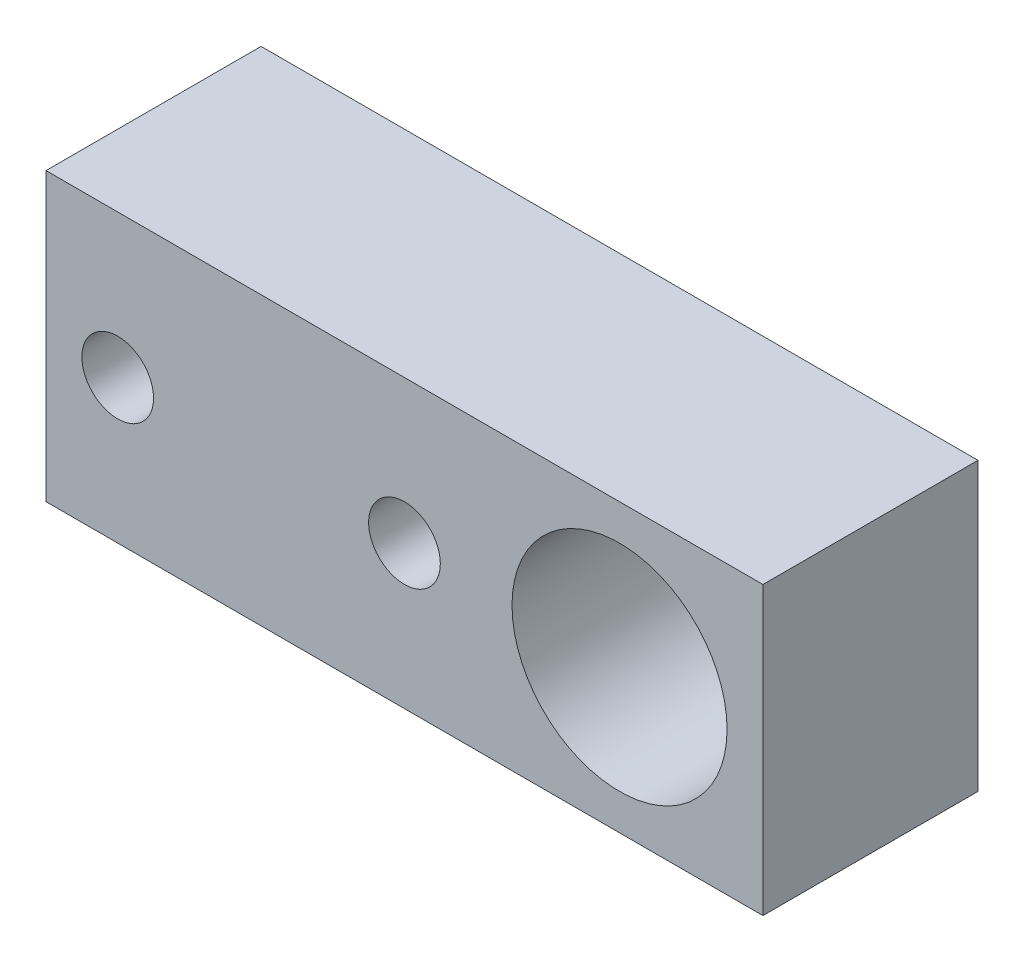
ISO-10303-21;
HEADER;
FILE_DESCRIPTION(('STEP AP214'),'2;1');
FILE_NAME('part.step','',(''),(''),'','','');
FILE_SCHEMA(('AUTOMOTIVE_DESIGN { 1 0 10303 214 1 1 1 1 }'));
ENDSEC;
DATA;
#1=APPLICATION_CONTEXT('core data for automotive mechanical design processes');
#2=APPLICATION_PROTOCOL_DEFINITION('international standard','automotive_design',2000,#1);
#3=PRODUCT_CONTEXT('',#1,'mechanical');
#4=PRODUCT('Part','Part','',(#3));
#5=PRODUCT_RELATED_PRODUCT_CATEGORY('part','',(#4));
#6=PRODUCT_DEFINITION_FORMATION('','',#4);
#7=PRODUCT_DEFINITION_CONTEXT('part definition',#1,'design');
#8=PRODUCT_DEFINITION('design','',#6,#7);
#9=PRODUCT_DEFINITION_SHAPE('','',#8);
#10=(LENGTH_UNIT() NAMED_UNIT(*) SI_UNIT(.MILLI.,.METRE.));
#11=(NAMED_UNIT(*) PLANE_ANGLE_UNIT() SI_UNIT($,.RADIAN.));
#12=(NAMED_UNIT(*) SI_UNIT($,.STERADIAN.) SOLID_ANGLE_UNIT());
#13=UNCERTAINTY_MEASURE_WITH_UNIT(LENGTH_MEASURE(1.E-05),#10,'distance_accuracy_value','');
#14=(GEOMETRIC_REPRESENTATION_CONTEXT(3) GLOBAL_UNCERTAINTY_ASSIGNED_CONTEXT((#13)) GLOBAL_UNIT_ASSIGNED_CONTEXT((#10,
#11,#12)) REPRESENTATION_CONTEXT('',''));
#15=CARTESIAN_POINT('',(0.,0.,0.));
#16=DIRECTION('',(0.,0.,1.));
#17=DIRECTION('',(1.,0.,0.));
#18=AXIS2_PLACEMENT_3D('',#15,#16,#17);
#19=CARTESIAN_POINT('',(25.,-10.,-7.5));
#20=DIRECTION('',(0.,0.,1.));
#21=DIRECTION('',(1.,0.,0.));
#22=AXIS2_PLACEMENT_3D('',#19,#20,#21);
#23=PLANE('',#22);
#24=CARTESIAN_POINT('',(0.,0.,-7.5));
#25=DIRECTION('',(0.,0.,1.));
#26=DIRECTION('',(1.,0.,0.));
#27=AXIS2_PLACEMENT_3D('',#24,#25,#26);
#28=CIRCLE('',#27,2.49999999999999);
#29=CARTESIAN_POINT('',(2.49999999999999,0.,-7.5));
#30=VERTEX_POINT('',#29);
#31=EDGE_CURVE('E123',#30,#30,#28,.T.);
#32=ORIENTED_EDGE('',*,*,#31,.T.);
#33=EDGE_LOOP('',(#32));
#34=FACE_BOUND('',#33,.T.);
#35=CARTESIAN_POINT('',(-20.,0.,-7.5));
#36=DIRECTION('',(0.,0.,1.));
#37=DIRECTION('',(1.,0.,0.));
#38=AXIS2_PLACEMENT_3D('',#35,#36,#37);
#39=CIRCLE('',#38,2.49999999999998);
#40=CARTESIAN_POINT('',(-17.5,0.,-7.5));
#41=VERTEX_POINT('',#40);
#42=EDGE_CURVE('E117',#41,#41,#39,.T.);
#43=ORIENTED_EDGE('',*,*,#42,.T.);
#44=EDGE_LOOP('',(#43));
#45=FACE_BOUND('',#44,.T.);
#46=CARTESIAN_POINT('',(15.,0.,-7.5));
#47=DIRECTION('',(0.,0.,1.));
#48=DIRECTION('',(1.,0.,0.));
#49=AXIS2_PLACEMENT_3D('',#46,#47,#48);
#50=CIRCLE('',#49,7.5);
#51=CARTESIAN_POINT('',(22.5,0.,-7.5));
#52=VERTEX_POINT('',#51);
#53=EDGE_CURVE('E114',#52,#52,#50,.T.);
#54=ORIENTED_EDGE('',*,*,#53,.T.);
#55=EDGE_LOOP('',(#54));
#56=FACE_BOUND('',#55,.T.);
#57=DIRECTION('',(0.,1.,0.));
#58=VECTOR('',#57,1.);
#59=CARTESIAN_POINT('',(-25.,-10.,-7.5));
#60=LINE('',#59,#58);
#61=CARTESIAN_POINT('',(-25.,-10.,-7.5));
#62=VERTEX_POINT('',#61);
#63=CARTESIAN_POINT('',(-25.,10.,-7.5));
#64=VERTEX_POINT('',#63);
#65=EDGE_CURVE('E101',#62,#64,#60,.T.);
#66=ORIENTED_EDGE('',*,*,#65,.T.);
#67=DIRECTION('',(-1.,0.,0.));
#68=VECTOR('',#67,1.);
#69=CARTESIAN_POINT('',(25.,10.,-7.5));
#70=LINE('',#69,#68);
#71=CARTESIAN_POINT('',(25.,10.,-7.5));
#72=VERTEX_POINT('',#71);
#73=EDGE_CURVE('E11',#72,#64,#70,.T.);
#74=ORIENTED_EDGE('',*,*,#73,.F.);
#75=DIRECTION('',(0.,1.,0.));
#76=VECTOR('',#75,1.);
#77=CARTESIAN_POINT('',(25.,-10.,-7.5));
#78=LINE('',#77,#76);
#79=CARTESIAN_POINT('',(25.,-10.,-7.5));
#80=VERTEX_POINT('',#79);
#81=EDGE_CURVE('E88',#80,#72,#78,.T.);
#82=ORIENTED_EDGE('',*,*,#81,.F.);
#83=DIRECTION('',(-1.,0.,0.));
#84=VECTOR('',#83,1.);
#85=CARTESIAN_POINT('',(25.,-10.,-7.5));
#86=LINE('',#85,#84);
#87=EDGE_CURVE('E97',#80,#62,#86,.T.);
#88=ORIENTED_EDGE('',*,*,#87,.T.);
#89=EDGE_LOOP('',(#66,#74,#82,#88));
#90=FACE_BOUND('',#89,.T.);
#91=ADVANCED_FACE('F36',(#34,#45,#56,#90),#23,.F.);
#92=CARTESIAN_POINT('',(25.,10.,7.5));
#93=DIRECTION('',(0.,-1.,0.));
#94=DIRECTION('',(0.,0.,-1.));
#95=AXIS2_PLACEMENT_3D('',#92,#93,#94);
#96=PLANE('',#95);
#97=DIRECTION('',(0.,0.,1.));
#98=VECTOR('',#97,1.);
#99=CARTESIAN_POINT('',(-25.,10.,7.5));
#100=LINE('',#99,#98);
#101=CARTESIAN_POINT('',(-25.,10.,7.5));
#102=VERTEX_POINT('',#101);
#103=EDGE_CURVE('E92',#64,#102,#100,.T.);
#104=ORIENTED_EDGE('',*,*,#103,.T.);
#105=DIRECTION('',(-1.,0.,0.));
#106=VECTOR('',#105,1.);
#107=CARTESIAN_POINT('',(25.,10.,7.5));
#108=LINE('',#107,#106);
#109=CARTESIAN_POINT('',(25.,10.,7.5));
#110=VERTEX_POINT('',#109);
#111=EDGE_CURVE('E45',#110,#102,#108,.T.);
#112=ORIENTED_EDGE('',*,*,#111,.F.);
#113=DIRECTION('',(0.,0.,1.));
#114=VECTOR('',#113,1.);
#115=CARTESIAN_POINT('',(25.,10.,7.5));
#116=LINE('',#115,#114);
#117=EDGE_CURVE('E83',#72,#110,#116,.T.);
#118=ORIENTED_EDGE('',*,*,#117,.F.);
#119=ORIENTED_EDGE('',*,*,#73,.T.);
#120=EDGE_LOOP('',(#104,#112,#118,#119));
#121=FACE_BOUND('',#120,.T.);
#122=ADVANCED_FACE('F91',(#121),#96,.F.);
#123=CARTESIAN_POINT('',(25.,-10.,7.5));
#124=DIRECTION('',(0.,0.,-1.));
#125=DIRECTION('',(-1.,0.,0.));
#126=AXIS2_PLACEMENT_3D('',#123,#124,#125);
#127=PLANE('',#126);
#128=CARTESIAN_POINT('',(0.,0.,7.5));
#129=DIRECTION('',(0.,0.,1.));
#130=DIRECTION('',(1.,0.,0.));
#131=AXIS2_PLACEMENT_3D('',#128,#129,#130);
#132=CIRCLE('',#131,2.49999999999999);
#133=CARTESIAN_POINT('',(2.49999999999999,0.,7.5));
#134=VERTEX_POINT('',#133);
#135=EDGE_CURVE('E126',#134,#134,#132,.T.);
#136=ORIENTED_EDGE('',*,*,#135,.F.);
#137=EDGE_LOOP('',(#136));
#138=FACE_BOUND('',#137,.T.);
#139=CARTESIAN_POINT('',(-20.,0.,7.5));
#140=DIRECTION('',(0.,0.,1.));
#141=DIRECTION('',(1.,0.,0.));
#142=AXIS2_PLACEMENT_3D('',#139,#140,#141);
#143=CIRCLE('',#142,2.49999999999999);
#144=CARTESIAN_POINT('',(-17.5,0.,7.5));
#145=VERTEX_POINT('',#144);
#146=EDGE_CURVE('E120',#145,#145,#143,.T.);
#147=ORIENTED_EDGE('',*,*,#146,.F.);
#148=EDGE_LOOP('',(#147));
#149=FACE_BOUND('',#148,.T.);
#150=CARTESIAN_POINT('',(15.,0.,7.5));
#151=DIRECTION('',(0.,0.,-1.));
#152=DIRECTION('',(-1.,0.,0.));
#153=AXIS2_PLACEMENT_3D('',#150,#151,#152);
#154=CIRCLE('',#153,7.5);
#155=CARTESIAN_POINT('',(7.5,0.,7.5));
#156=VERTEX_POINT('',#155);
#157=EDGE_CURVE('E39',#156,#156,#154,.T.);
#158=ORIENTED_EDGE('',*,*,#157,.T.);
#159=EDGE_LOOP('',(#158));
#160=FACE_BOUND('',#159,.T.);
#161=DIRECTION('',(0.,-1.,0.));
#162=VECTOR('',#161,1.);
#163=CARTESIAN_POINT('',(-25.,-10.,7.5));
#164=LINE('',#163,#162);
#165=CARTESIAN_POINT('',(-25.,-10.,7.5));
#166=VERTEX_POINT('',#165);
#167=EDGE_CURVE('E70',#102,#166,#164,.T.);
#168=ORIENTED_EDGE('',*,*,#167,.T.);
#169=DIRECTION('',(-1.,0.,0.));
#170=VECTOR('',#169,1.);
#171=CARTESIAN_POINT('',(25.,-10.,7.5));
#172=LINE('',#171,#170);
#173=CARTESIAN_POINT('',(25.,-10.,7.5));
#174=VERTEX_POINT('',#173);
#175=EDGE_CURVE('E93',#174,#166,#172,.T.);
#176=ORIENTED_EDGE('',*,*,#175,.F.);
#177=DIRECTION('',(0.,-1.,0.));
#178=VECTOR('',#177,1.);
#179=CARTESIAN_POINT('',(25.,-10.,7.5));
#180=LINE('',#179,#178);
#181=EDGE_CURVE('E86',#110,#174,#180,.T.);
#182=ORIENTED_EDGE('',*,*,#181,.F.);
#183=ORIENTED_EDGE('',*,*,#111,.T.);
#184=EDGE_LOOP('',(#168,#176,#182,#183));
#185=FACE_BOUND('',#184,.T.);
#186=ADVANCED_FACE('F95',(#138,#149,#160,#185),#127,.F.);
#187=CARTESIAN_POINT('',(25.,-10.,7.5));
#188=DIRECTION('',(0.,1.,0.));
#189=DIRECTION('',(0.,0.,1.));
#190=AXIS2_PLACEMENT_3D('',#187,#188,#189);
#191=PLANE('',#190);
#192=DIRECTION('',(0.,0.,-1.));
#193=VECTOR('',#192,1.);
#194=CARTESIAN_POINT('',(-25.,-10.,7.5));
#195=LINE('',#194,#193);
#196=EDGE_CURVE('E76',#166,#62,#195,.T.);
#197=ORIENTED_EDGE('',*,*,#196,.T.);
#198=ORIENTED_EDGE('',*,*,#87,.F.);
#199=DIRECTION('',(0.,0.,-1.));
#200=VECTOR('',#199,1.);
#201=CARTESIAN_POINT('',(25.,-10.,7.5));
#202=LINE('',#201,#200);
#203=EDGE_CURVE('E53',#174,#80,#202,.T.);
#204=ORIENTED_EDGE('',*,*,#203,.F.);
#205=ORIENTED_EDGE('',*,*,#175,.T.);
#206=EDGE_LOOP('',(#197,#198,#204,#205));
#207=FACE_BOUND('',#206,.T.);
#208=ADVANCED_FACE('F108',(#207),#191,.F.);
#209=CARTESIAN_POINT('',(25.,0.,0.));
#210=DIRECTION('',(-1.,0.,0.));
#211=DIRECTION('',(0.,0.,1.));
#212=AXIS2_PLACEMENT_3D('',#209,#210,#211);
#213=PLANE('',#212);
#214=ORIENTED_EDGE('',*,*,#81,.T.);
#215=ORIENTED_EDGE('',*,*,#117,.T.);
#216=ORIENTED_EDGE('',*,*,#181,.T.);
#217=ORIENTED_EDGE('',*,*,#203,.T.);
#218=EDGE_LOOP('',(#214,#215,#216,#217));
#219=FACE_BOUND('',#218,.T.);
#220=ADVANCED_FACE('F84',(#219),#213,.F.);
#221=CARTESIAN_POINT('',(-25.,0.,0.));
#222=DIRECTION('',(-1.,0.,0.));
#223=DIRECTION('',(0.,0.,1.));
#224=AXIS2_PLACEMENT_3D('',#221,#222,#223);
#225=PLANE('',#224);
#226=ORIENTED_EDGE('',*,*,#65,.F.);
#227=ORIENTED_EDGE('',*,*,#196,.F.);
#228=ORIENTED_EDGE('',*,*,#167,.F.);
#229=ORIENTED_EDGE('',*,*,#103,.F.);
#230=EDGE_LOOP('',(#226,#227,#228,#229));
#231=FACE_BOUND('',#230,.T.);
#232=ADVANCED_FACE('F111',(#231),#225,.T.);
#233=CARTESIAN_POINT('',(15.,0.,-7.5));
#234=DIRECTION('',(0.,0.,1.));
#235=DIRECTION('',(1.,0.,0.));
#236=AXIS2_PLACEMENT_3D('',#233,#234,#235);
#237=CYLINDRICAL_SURFACE('',#236,7.5);
#238=ORIENTED_EDGE('',*,*,#53,.F.);
#239=EDGE_LOOP('',(#238));
#240=FACE_BOUND('',#239,.T.);
#241=ORIENTED_EDGE('',*,*,#157,.F.);
#242=EDGE_LOOP('',(#241));
#243=FACE_BOUND('',#242,.T.);
#244=ADVANCED_FACE('F140',(#240,#243),#237,.F.);
#245=CARTESIAN_POINT('',(-20.,0.,7.5));
#246=DIRECTION('',(0.,0.,1.));
#247=DIRECTION('',(1.,0.,0.));
#248=AXIS2_PLACEMENT_3D('',#245,#246,#247);
#249=CYLINDRICAL_SURFACE('',#248,2.49999999999999);
#250=ORIENTED_EDGE('',*,*,#42,.F.);
#251=EDGE_LOOP('',(#250));
#252=FACE_BOUND('',#251,.T.);
#253=ORIENTED_EDGE('',*,*,#146,.T.);
#254=EDGE_LOOP('',(#253));
#255=FACE_BOUND('',#254,.T.);
#256=ADVANCED_FACE('F142',(#252,#255),#249,.F.);
#257=CARTESIAN_POINT('',(0.,0.,7.5));
#258=DIRECTION('',(0.,0.,1.));
#259=DIRECTION('',(1.,0.,0.));
#260=AXIS2_PLACEMENT_3D('',#257,#258,#259);
#261=CYLINDRICAL_SURFACE('',#260,2.49999999999999);
#262=ORIENTED_EDGE('',*,*,#31,.F.);
#263=EDGE_LOOP('',(#262));
#264=FACE_BOUND('',#263,.T.);
#265=ORIENTED_EDGE('',*,*,#135,.T.);
#266=EDGE_LOOP('',(#265));
#267=FACE_BOUND('',#266,.T.);
#268=ADVANCED_FACE('F130',(#264,#267),#261,.F.);
#269=CLOSED_SHELL('',(#91,#122,#186,#208,#220,#232,#244,#256,#268));
#270=MANIFOLD_SOLID_BREP('B2',#269);
#271=ADVANCED_BREP_SHAPE_REPRESENTATION('',(#18,#270),#14);
#272=SHAPE_DEFINITION_REPRESENTATION(#9,#271);
ENDSEC;
END-ISO-10303-21;
